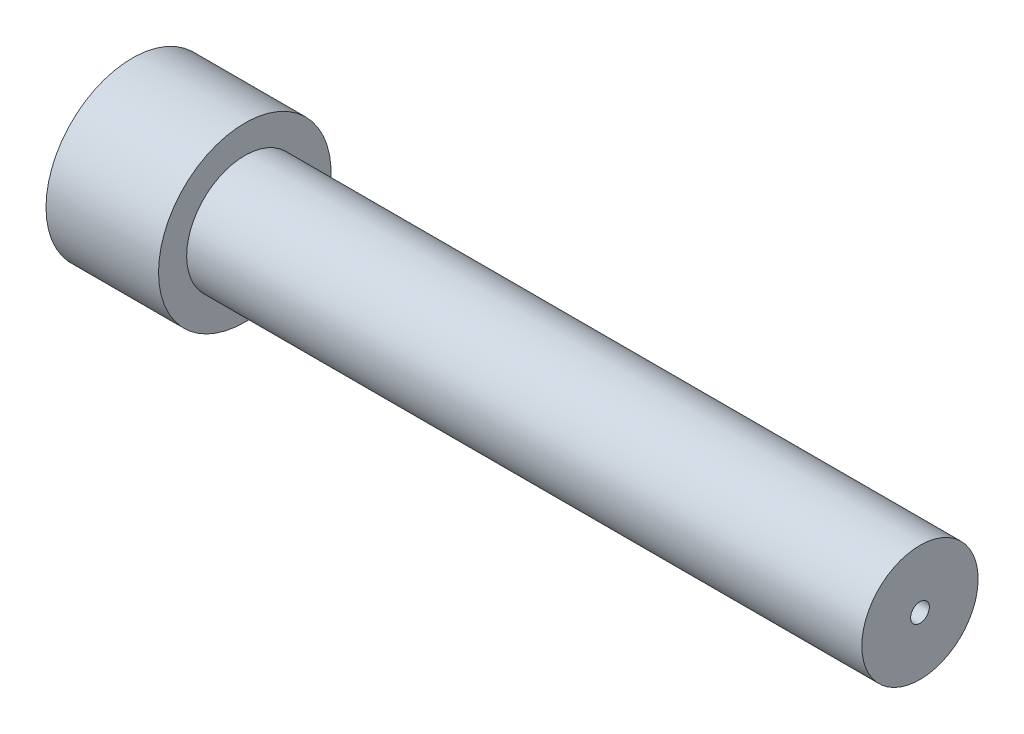
ISO-10303-21;
HEADER;
FILE_DESCRIPTION(('STEP AP214'),'2;1');
FILE_NAME('part.step','',(''),(''),'','','');
FILE_SCHEMA(('AUTOMOTIVE_DESIGN { 1 0 10303 214 1 1 1 1 }'));
ENDSEC;
DATA;
#1=APPLICATION_CONTEXT('core data for automotive mechanical design processes');
#2=APPLICATION_PROTOCOL_DEFINITION('international standard','automotive_design',2000,#1);
#3=PRODUCT_CONTEXT('',#1,'mechanical');
#4=PRODUCT('Part','Part','',(#3));
#5=PRODUCT_RELATED_PRODUCT_CATEGORY('part','',(#4));
#6=PRODUCT_DEFINITION_FORMATION('','',#4);
#7=PRODUCT_DEFINITION_CONTEXT('part definition',#1,'design');
#8=PRODUCT_DEFINITION('design','',#6,#7);
#9=PRODUCT_DEFINITION_SHAPE('','',#8);
#10=(LENGTH_UNIT() NAMED_UNIT(*) SI_UNIT(.MILLI.,.METRE.));
#11=(NAMED_UNIT(*) PLANE_ANGLE_UNIT() SI_UNIT($,.RADIAN.));
#12=(NAMED_UNIT(*) SI_UNIT($,.STERADIAN.) SOLID_ANGLE_UNIT());
#13=UNCERTAINTY_MEASURE_WITH_UNIT(LENGTH_MEASURE(1.E-05),#10,'distance_accuracy_value','');
#14=(GEOMETRIC_REPRESENTATION_CONTEXT(3) GLOBAL_UNCERTAINTY_ASSIGNED_CONTEXT((#13)) GLOBAL_UNIT_ASSIGNED_CONTEXT((#10,
#11,#12)) REPRESENTATION_CONTEXT('',''));
#15=CARTESIAN_POINT('',(0.,0.,0.));
#16=DIRECTION('',(0.,0.,1.));
#17=DIRECTION('',(1.,0.,0.));
#18=AXIS2_PLACEMENT_3D('',#15,#16,#17);
#19=CARTESIAN_POINT('',(0.,0.,0.));
#20=DIRECTION('',(1.,0.,0.));
#21=DIRECTION('',(0.,0.,-1.));
#22=AXIS2_PLACEMENT_3D('',#19,#20,#21);
#23=PLANE('',#22);
#24=CARTESIAN_POINT('',(0.,0.,0.));
#25=DIRECTION('',(-1.,0.,0.));
#26=DIRECTION('',(0.,0.,1.));
#27=AXIS2_PLACEMENT_3D('',#24,#25,#26);
#28=CIRCLE('',#27,2.3);
#29=CARTESIAN_POINT('',(0.,0.,2.3));
#30=VERTEX_POINT('',#29);
#31=EDGE_CURVE('E10',#30,#30,#28,.T.);
#32=ORIENTED_EDGE('',*,*,#31,.T.);
#33=EDGE_LOOP('',(#32));
#34=FACE_BOUND('',#33,.T.);
#35=ADVANCED_FACE('F33',(#34),#23,.F.);
#36=CARTESIAN_POINT('',(0.,0.,0.));
#37=DIRECTION('',(-1.,0.,0.));
#38=DIRECTION('',(0.,0.,1.));
#39=AXIS2_PLACEMENT_3D('',#36,#37,#38);
#40=CYLINDRICAL_SURFACE('',#39,2.3);
#41=ORIENTED_EDGE('',*,*,#31,.F.);
#42=EDGE_LOOP('',(#41));
#43=FACE_BOUND('',#42,.T.);
#44=CARTESIAN_POINT('',(3.,0.,0.));
#45=DIRECTION('',(-1.,0.,0.));
#46=DIRECTION('',(0.,0.,1.));
#47=AXIS2_PLACEMENT_3D('',#44,#45,#46);
#48=CIRCLE('',#47,2.3);
#49=CARTESIAN_POINT('',(3.,0.,2.3));
#50=VERTEX_POINT('',#49);
#51=EDGE_CURVE('E39',#50,#50,#48,.T.);
#52=ORIENTED_EDGE('',*,*,#51,.T.);
#53=EDGE_LOOP('',(#52));
#54=FACE_BOUND('',#53,.T.);
#55=ADVANCED_FACE('F71',(#43,#54),#40,.T.);
#56=CARTESIAN_POINT('',(3.,2.3,0.));
#57=DIRECTION('',(-1.,0.,0.));
#58=DIRECTION('',(0.,0.,1.));
#59=AXIS2_PLACEMENT_3D('',#56,#57,#58);
#60=PLANE('',#59);
#61=ORIENTED_EDGE('',*,*,#51,.F.);
#62=EDGE_LOOP('',(#61));
#63=FACE_BOUND('',#62,.T.);
#64=CARTESIAN_POINT('',(3.,0.,0.));
#65=DIRECTION('',(-1.,0.,0.));
#66=DIRECTION('',(0.,0.,1.));
#67=AXIS2_PLACEMENT_3D('',#64,#65,#66);
#68=CIRCLE('',#67,1.55);
#69=CARTESIAN_POINT('',(3.,0.,1.55));
#70=VERTEX_POINT('',#69);
#71=EDGE_CURVE('E43',#70,#70,#68,.T.);
#72=ORIENTED_EDGE('',*,*,#71,.T.);
#73=EDGE_LOOP('',(#72));
#74=FACE_BOUND('',#73,.T.);
#75=ADVANCED_FACE('F75',(#63,#74),#60,.F.);
#76=CARTESIAN_POINT('',(0.,0.,0.));
#77=DIRECTION('',(-1.,0.,0.));
#78=DIRECTION('',(0.,0.,1.));
#79=AXIS2_PLACEMENT_3D('',#76,#77,#78);
#80=CYLINDRICAL_SURFACE('',#79,1.55);
#81=ORIENTED_EDGE('',*,*,#71,.F.);
#82=EDGE_LOOP('',(#81));
#83=FACE_BOUND('',#82,.T.);
#84=CARTESIAN_POINT('',(21.,0.,0.));
#85=DIRECTION('',(-1.,0.,0.));
#86=DIRECTION('',(0.,0.,1.));
#87=AXIS2_PLACEMENT_3D('',#84,#85,#86);
#88=CIRCLE('',#87,1.55);
#89=CARTESIAN_POINT('',(21.,0.,1.55));
#90=VERTEX_POINT('',#89);
#91=EDGE_CURVE('E47',#90,#90,#88,.T.);
#92=ORIENTED_EDGE('',*,*,#91,.T.);
#93=EDGE_LOOP('',(#92));
#94=FACE_BOUND('',#93,.T.);
#95=ADVANCED_FACE('F80',(#83,#94),#80,.T.);
#96=CARTESIAN_POINT('',(21.,1.55,0.));
#97=DIRECTION('',(-1.,0.,0.));
#98=DIRECTION('',(0.,0.,1.));
#99=AXIS2_PLACEMENT_3D('',#96,#97,#98);
#100=PLANE('',#99);
#101=ORIENTED_EDGE('',*,*,#91,.F.);
#102=EDGE_LOOP('',(#101));
#103=FACE_BOUND('',#102,.T.);
#104=CARTESIAN_POINT('',(21.,0.,0.));
#105=DIRECTION('',(-1.,0.,0.));
#106=DIRECTION('',(0.,0.,1.));
#107=AXIS2_PLACEMENT_3D('',#104,#105,#106);
#108=CIRCLE('',#107,0.25);
#109=CARTESIAN_POINT('',(21.,0.,0.25));
#110=VERTEX_POINT('',#109);
#111=EDGE_CURVE('E52',#110,#110,#108,.T.);
#112=ORIENTED_EDGE('',*,*,#111,.T.);
#113=EDGE_LOOP('',(#112));
#114=FACE_BOUND('',#113,.T.);
#115=ADVANCED_FACE('F67',(#103,#114),#100,.F.);
#116=CARTESIAN_POINT('',(0.,0.,0.));
#117=DIRECTION('',(-1.,0.,0.));
#118=DIRECTION('',(0.,0.,1.));
#119=AXIS2_PLACEMENT_3D('',#116,#117,#118);
#120=CYLINDRICAL_SURFACE('',#119,0.25);
#121=ORIENTED_EDGE('',*,*,#111,.F.);
#122=EDGE_LOOP('',(#121));
#123=FACE_BOUND('',#122,.T.);
#124=CARTESIAN_POINT('',(16.,0.,0.));
#125=DIRECTION('',(-1.,0.,0.));
#126=DIRECTION('',(0.,0.,1.));
#127=AXIS2_PLACEMENT_3D('',#124,#125,#126);
#128=CIRCLE('',#127,0.25);
#129=CARTESIAN_POINT('',(16.,0.,0.25));
#130=VERTEX_POINT('',#129);
#131=EDGE_CURVE('E55',#130,#130,#128,.T.);
#132=ORIENTED_EDGE('',*,*,#131,.T.);
#133=EDGE_LOOP('',(#132));
#134=FACE_BOUND('',#133,.T.);
#135=ADVANCED_FACE('F59',(#123,#134),#120,.F.);
#136=CARTESIAN_POINT('',(16.,0.25,0.));
#137=DIRECTION('',(-1.,0.,0.));
#138=DIRECTION('',(0.,0.,1.));
#139=AXIS2_PLACEMENT_3D('',#136,#137,#138);
#140=PLANE('',#139);
#141=ORIENTED_EDGE('',*,*,#131,.F.);
#142=EDGE_LOOP('',(#141));
#143=FACE_BOUND('',#142,.T.);
#144=ADVANCED_FACE('F61',(#143),#140,.F.);
#145=CLOSED_SHELL('',(#35,#55,#75,#95,#115,#135,#144));
#146=MANIFOLD_SOLID_BREP('B2',#145);
#147=ADVANCED_BREP_SHAPE_REPRESENTATION('',(#18,#146),#14);
#148=SHAPE_DEFINITION_REPRESENTATION(#9,#147);
ENDSEC;
END-ISO-10303-21;
